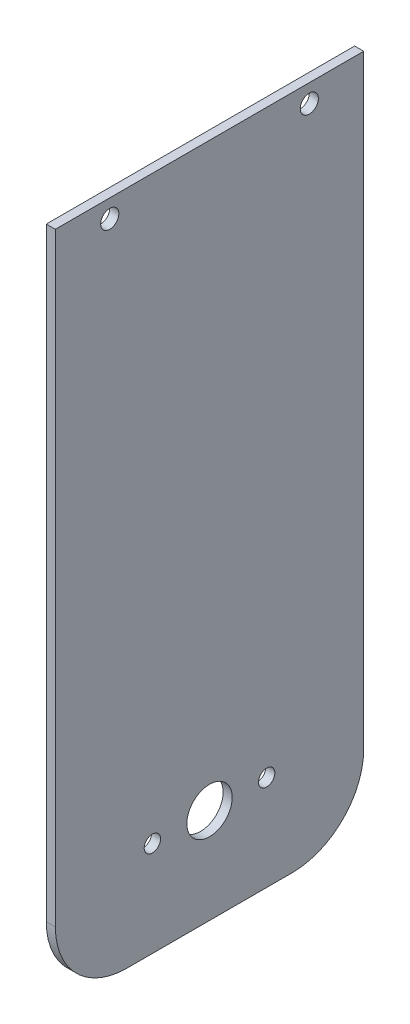
ISO-10303-21;
HEADER;
FILE_DESCRIPTION(('STEP AP214'),'2;1');
FILE_NAME('part.step','',(''),(''),'','','');
FILE_SCHEMA(('AUTOMOTIVE_DESIGN { 1 0 10303 214 1 1 1 1 }'));
ENDSEC;
DATA;
#1=APPLICATION_CONTEXT('core data for automotive mechanical design processes');
#2=APPLICATION_PROTOCOL_DEFINITION('international standard','automotive_design',2000,#1);
#3=PRODUCT_CONTEXT('',#1,'mechanical');
#4=PRODUCT('Part','Part','',(#3));
#5=PRODUCT_RELATED_PRODUCT_CATEGORY('part','',(#4));
#6=PRODUCT_DEFINITION_FORMATION('','',#4);
#7=PRODUCT_DEFINITION_CONTEXT('part definition',#1,'design');
#8=PRODUCT_DEFINITION('design','',#6,#7);
#9=PRODUCT_DEFINITION_SHAPE('','',#8);
#10=(LENGTH_UNIT() NAMED_UNIT(*) SI_UNIT(.MILLI.,.METRE.));
#11=(NAMED_UNIT(*) PLANE_ANGLE_UNIT() SI_UNIT($,.RADIAN.));
#12=(NAMED_UNIT(*) SI_UNIT($,.STERADIAN.) SOLID_ANGLE_UNIT());
#13=UNCERTAINTY_MEASURE_WITH_UNIT(LENGTH_MEASURE(1.E-05),#10,'distance_accuracy_value','');
#14=(GEOMETRIC_REPRESENTATION_CONTEXT(3) GLOBAL_UNCERTAINTY_ASSIGNED_CONTEXT((#13)) GLOBAL_UNIT_ASSIGNED_CONTEXT((#10,
#11,#12)) REPRESENTATION_CONTEXT('',''));
#15=CARTESIAN_POINT('',(0.,0.,0.));
#16=DIRECTION('',(0.,0.,1.));
#17=DIRECTION('',(1.,0.,0.));
#18=AXIS2_PLACEMENT_3D('',#15,#16,#17);
#19=CARTESIAN_POINT('',(3.175,0.,0.));
#20=DIRECTION('',(1.,0.,0.));
#21=DIRECTION('',(0.,0.,-1.));
#22=AXIS2_PLACEMENT_3D('',#19,#20,#21);
#23=PLANE('',#22);
#24=CARTESIAN_POINT('',(3.175,111.9175,34.925));
#25=DIRECTION('',(1.,0.,0.));
#26=DIRECTION('',(0.,0.,-1.));
#27=AXIS2_PLACEMENT_3D('',#24,#25,#26);
#28=CIRCLE('',#27,3.175);
#29=CARTESIAN_POINT('',(3.175,111.9175,31.75));
#30=VERTEX_POINT('',#29);
#31=EDGE_CURVE('E218',#30,#30,#28,.T.);
#32=ORIENTED_EDGE('',*,*,#31,.F.);
#33=EDGE_LOOP('',(#32));
#34=FACE_BOUND('',#33,.T.);
#35=CARTESIAN_POINT('',(3.175,-84.9275,-20.));
#36=DIRECTION('',(1.,0.,0.));
#37=DIRECTION('',(0.,0.,-1.));
#38=AXIS2_PLACEMENT_3D('',#35,#36,#37);
#39=CIRCLE('',#38,2.86);
#40=CARTESIAN_POINT('',(3.175,-84.9275,-22.86));
#41=VERTEX_POINT('',#40);
#42=EDGE_CURVE('E197',#41,#41,#39,.T.);
#43=ORIENTED_EDGE('',*,*,#42,.F.);
#44=EDGE_LOOP('',(#43));
#45=FACE_BOUND('',#44,.T.);
#46=DIRECTION('',(0.,-1.,0.));
#47=VECTOR('',#46,1.);
#48=CARTESIAN_POINT('',(3.175,118.2675,53.975));
#49=LINE('',#48,#47);
#50=CARTESIAN_POINT('',(3.175,118.2675,53.975));
#51=VERTEX_POINT('',#50);
#52=CARTESIAN_POINT('',(3.175,-93.2675,53.975));
#53=VERTEX_POINT('',#52);
#54=EDGE_CURVE('E124',#51,#53,#49,.T.);
#55=ORIENTED_EDGE('',*,*,#54,.T.);
#56=CARTESIAN_POINT('',(3.175,-93.2675,28.975));
#57=DIRECTION('',(1.,0.,0.));
#58=DIRECTION('',(0.,0.,-1.));
#59=AXIS2_PLACEMENT_3D('',#56,#57,#58);
#60=CIRCLE('',#59,25.);
#61=CARTESIAN_POINT('',(3.175,-118.2675,28.975));
#62=VERTEX_POINT('',#61);
#63=EDGE_CURVE('E61',#53,#62,#60,.T.);
#64=ORIENTED_EDGE('',*,*,#63,.T.);
#65=DIRECTION('',(0.,0.,-1.));
#66=VECTOR('',#65,1.);
#67=CARTESIAN_POINT('',(3.175,-118.2675,53.975));
#68=LINE('',#67,#66);
#69=CARTESIAN_POINT('',(3.175,-118.2675,-28.975));
#70=VERTEX_POINT('',#69);
#71=EDGE_CURVE('E137',#62,#70,#68,.T.);
#72=ORIENTED_EDGE('',*,*,#71,.T.);
#73=CARTESIAN_POINT('',(3.175,-93.2675,-28.975));
#74=DIRECTION('',(1.,0.,0.));
#75=DIRECTION('',(0.,0.,-1.));
#76=AXIS2_PLACEMENT_3D('',#73,#74,#75);
#77=CIRCLE('',#76,25.);
#78=CARTESIAN_POINT('',(3.175,-93.2675,-53.975));
#79=VERTEX_POINT('',#78);
#80=EDGE_CURVE('E68',#70,#79,#77,.T.);
#81=ORIENTED_EDGE('',*,*,#80,.T.);
#82=DIRECTION('',(0.,1.,0.));
#83=VECTOR('',#82,1.);
#84=CARTESIAN_POINT('',(3.175,118.2675,-53.975));
#85=LINE('',#84,#83);
#86=CARTESIAN_POINT('',(3.175,118.2675,-53.975));
#87=VERTEX_POINT('',#86);
#88=EDGE_CURVE('E106',#79,#87,#85,.T.);
#89=ORIENTED_EDGE('',*,*,#88,.T.);
#90=DIRECTION('',(0.,0.,1.));
#91=VECTOR('',#90,1.);
#92=CARTESIAN_POINT('',(3.175,118.2675,53.975));
#93=LINE('',#92,#91);
#94=EDGE_CURVE('E109',#87,#51,#93,.T.);
#95=ORIENTED_EDGE('',*,*,#94,.T.);
#96=EDGE_LOOP('',(#55,#64,#72,#81,#89,#95));
#97=FACE_BOUND('',#96,.T.);
#98=CARTESIAN_POINT('',(3.175,-84.9275,0.));
#99=DIRECTION('',(1.,0.,0.));
#100=DIRECTION('',(0.,0.,-1.));
#101=AXIS2_PLACEMENT_3D('',#98,#99,#100);
#102=CIRCLE('',#101,7.94);
#103=CARTESIAN_POINT('',(3.175,-84.9275,-7.94000000000003));
#104=VERTEX_POINT('',#103);
#105=EDGE_CURVE('E181',#104,#104,#102,.T.);
#106=ORIENTED_EDGE('',*,*,#105,.F.);
#107=EDGE_LOOP('',(#106));
#108=FACE_BOUND('',#107,.T.);
#109=CARTESIAN_POINT('',(3.175,-84.9275,20.));
#110=DIRECTION('',(1.,0.,0.));
#111=DIRECTION('',(0.,0.,-1.));
#112=AXIS2_PLACEMENT_3D('',#109,#110,#111);
#113=CIRCLE('',#112,2.86);
#114=CARTESIAN_POINT('',(3.175,-84.9275,17.14));
#115=VERTEX_POINT('',#114);
#116=EDGE_CURVE('E205',#115,#115,#113,.T.);
#117=ORIENTED_EDGE('',*,*,#116,.F.);
#118=EDGE_LOOP('',(#117));
#119=FACE_BOUND('',#118,.T.);
#120=CARTESIAN_POINT('',(3.175,111.9175,-34.925));
#121=DIRECTION('',(1.,0.,0.));
#122=DIRECTION('',(0.,0.,-1.));
#123=AXIS2_PLACEMENT_3D('',#120,#121,#122);
#124=CIRCLE('',#123,3.175);
#125=CARTESIAN_POINT('',(3.175,111.9175,-38.1));
#126=VERTEX_POINT('',#125);
#127=EDGE_CURVE('E232',#126,#126,#124,.T.);
#128=ORIENTED_EDGE('',*,*,#127,.F.);
#129=EDGE_LOOP('',(#128));
#130=FACE_BOUND('',#129,.T.);
#131=ADVANCED_FACE('F52',(#34,#45,#97,#108,#119,#130),#23,.T.);
#132=CARTESIAN_POINT('',(0.,0.,0.));
#133=DIRECTION('',(1.,0.,0.));
#134=DIRECTION('',(0.,0.,-1.));
#135=AXIS2_PLACEMENT_3D('',#132,#133,#134);
#136=PLANE('',#135);
#137=DIRECTION('',(0.,0.,-1.));
#138=VECTOR('',#137,1.);
#139=CARTESIAN_POINT('',(0.,-118.2675,53.975));
#140=LINE('',#139,#138);
#141=CARTESIAN_POINT('',(0.,-118.2675,28.975));
#142=VERTEX_POINT('',#141);
#143=CARTESIAN_POINT('',(0.,-118.2675,-28.975));
#144=VERTEX_POINT('',#143);
#145=EDGE_CURVE('E115',#142,#144,#140,.T.);
#146=ORIENTED_EDGE('',*,*,#145,.F.);
#147=CARTESIAN_POINT('',(0.,-93.2675,28.975));
#148=DIRECTION('',(1.,0.,0.));
#149=DIRECTION('',(0.,0.,-1.));
#150=AXIS2_PLACEMENT_3D('',#147,#148,#149);
#151=CIRCLE('',#150,25.);
#152=CARTESIAN_POINT('',(0.,-93.2675,53.975));
#153=VERTEX_POINT('',#152);
#154=EDGE_CURVE('E147',#142,#153,#151,.F.);
#155=ORIENTED_EDGE('',*,*,#154,.T.);
#156=DIRECTION('',(0.,-1.,0.));
#157=VECTOR('',#156,1.);
#158=CARTESIAN_POINT('',(0.,118.2675,53.975));
#159=LINE('',#158,#157);
#160=CARTESIAN_POINT('',(0.,118.2675,53.975));
#161=VERTEX_POINT('',#160);
#162=EDGE_CURVE('E170',#161,#153,#159,.T.);
#163=ORIENTED_EDGE('',*,*,#162,.F.);
#164=DIRECTION('',(0.,0.,1.));
#165=VECTOR('',#164,1.);
#166=CARTESIAN_POINT('',(0.,118.2675,53.975));
#167=LINE('',#166,#165);
#168=CARTESIAN_POINT('',(0.,118.2675,-53.975));
#169=VERTEX_POINT('',#168);
#170=EDGE_CURVE('E173',#169,#161,#167,.T.);
#171=ORIENTED_EDGE('',*,*,#170,.F.);
#172=DIRECTION('',(0.,1.,0.));
#173=VECTOR('',#172,1.);
#174=CARTESIAN_POINT('',(0.,118.2675,-53.975));
#175=LINE('',#174,#173);
#176=CARTESIAN_POINT('',(0.,-93.2675,-53.975));
#177=VERTEX_POINT('',#176);
#178=EDGE_CURVE('E128',#177,#169,#175,.T.);
#179=ORIENTED_EDGE('',*,*,#178,.F.);
#180=CARTESIAN_POINT('',(0.,-93.2675,-28.975));
#181=DIRECTION('',(1.,0.,0.));
#182=DIRECTION('',(0.,0.,-1.));
#183=AXIS2_PLACEMENT_3D('',#180,#181,#182);
#184=CIRCLE('',#183,25.);
#185=EDGE_CURVE('E144',#177,#144,#184,.F.);
#186=ORIENTED_EDGE('',*,*,#185,.T.);
#187=EDGE_LOOP('',(#146,#155,#163,#171,#179,#186));
#188=FACE_BOUND('',#187,.T.);
#189=CARTESIAN_POINT('',(0.,-84.9275,0.));
#190=DIRECTION('',(1.,0.,0.));
#191=DIRECTION('',(0.,0.,-1.));
#192=AXIS2_PLACEMENT_3D('',#189,#190,#191);
#193=CIRCLE('',#192,7.94);
#194=CARTESIAN_POINT('',(0.,-84.9275,-7.94000000000003));
#195=VERTEX_POINT('',#194);
#196=EDGE_CURVE('E193',#195,#195,#193,.T.);
#197=ORIENTED_EDGE('',*,*,#196,.T.);
#198=EDGE_LOOP('',(#197));
#199=FACE_BOUND('',#198,.T.);
#200=CARTESIAN_POINT('',(0.,-84.9275,-20.));
#201=DIRECTION('',(1.,0.,0.));
#202=DIRECTION('',(0.,0.,-1.));
#203=AXIS2_PLACEMENT_3D('',#200,#201,#202);
#204=CIRCLE('',#203,2.86);
#205=CARTESIAN_POINT('',(0.,-84.9275,-22.86));
#206=VERTEX_POINT('',#205);
#207=EDGE_CURVE('E200',#206,#206,#204,.T.);
#208=ORIENTED_EDGE('',*,*,#207,.T.);
#209=EDGE_LOOP('',(#208));
#210=FACE_BOUND('',#209,.T.);
#211=CARTESIAN_POINT('',(0.,-84.9275,20.));
#212=DIRECTION('',(1.,0.,0.));
#213=DIRECTION('',(0.,0.,-1.));
#214=AXIS2_PLACEMENT_3D('',#211,#212,#213);
#215=CIRCLE('',#214,2.86);
#216=CARTESIAN_POINT('',(0.,-84.9275,17.14));
#217=VERTEX_POINT('',#216);
#218=EDGE_CURVE('E214',#217,#217,#215,.T.);
#219=ORIENTED_EDGE('',*,*,#218,.T.);
#220=EDGE_LOOP('',(#219));
#221=FACE_BOUND('',#220,.T.);
#222=CARTESIAN_POINT('',(0.,111.9175,34.925));
#223=DIRECTION('',(1.,0.,0.));
#224=DIRECTION('',(0.,0.,-1.));
#225=AXIS2_PLACEMENT_3D('',#222,#223,#224);
#226=CIRCLE('',#225,3.175);
#227=CARTESIAN_POINT('',(0.,111.9175,31.75));
#228=VERTEX_POINT('',#227);
#229=EDGE_CURVE('E227',#228,#228,#226,.T.);
#230=ORIENTED_EDGE('',*,*,#229,.T.);
#231=EDGE_LOOP('',(#230));
#232=FACE_BOUND('',#231,.T.);
#233=CARTESIAN_POINT('',(0.,111.9175,-34.925));
#234=DIRECTION('',(1.,0.,0.));
#235=DIRECTION('',(0.,0.,-1.));
#236=AXIS2_PLACEMENT_3D('',#233,#234,#235);
#237=CIRCLE('',#236,3.175);
#238=CARTESIAN_POINT('',(0.,111.9175,-38.1));
#239=VERTEX_POINT('',#238);
#240=EDGE_CURVE('E237',#239,#239,#237,.T.);
#241=ORIENTED_EDGE('',*,*,#240,.T.);
#242=EDGE_LOOP('',(#241));
#243=FACE_BOUND('',#242,.T.);
#244=ADVANCED_FACE('F168',(#188,#199,#210,#221,#232,#243),#136,.F.);
#245=CARTESIAN_POINT('',(3.175,118.2675,-53.975));
#246=DIRECTION('',(0.,0.,1.));
#247=DIRECTION('',(0.,-1.,0.));
#248=AXIS2_PLACEMENT_3D('',#245,#246,#247);
#249=PLANE('',#248);
#250=ORIENTED_EDGE('',*,*,#88,.F.);
#251=DIRECTION('',(-1.,0.,0.));
#252=VECTOR('',#251,1.);
#253=CARTESIAN_POINT('',(3.175,-93.2675,-53.975));
#254=LINE('',#253,#252);
#255=EDGE_CURVE('E12',#79,#177,#254,.T.);
#256=ORIENTED_EDGE('',*,*,#255,.T.);
#257=ORIENTED_EDGE('',*,*,#178,.T.);
#258=DIRECTION('',(-1.,0.,0.));
#259=VECTOR('',#258,1.);
#260=CARTESIAN_POINT('',(3.175,118.2675,-53.975));
#261=LINE('',#260,#259);
#262=EDGE_CURVE('E120',#87,#169,#261,.T.);
#263=ORIENTED_EDGE('',*,*,#262,.F.);
#264=EDGE_LOOP('',(#250,#256,#257,#263));
#265=FACE_BOUND('',#264,.T.);
#266=ADVANCED_FACE('F126',(#265),#249,.F.);
#267=CARTESIAN_POINT('',(3.175,118.2675,53.975));
#268=DIRECTION('',(0.,-1.,0.));
#269=DIRECTION('',(0.,0.,-1.));
#270=AXIS2_PLACEMENT_3D('',#267,#268,#269);
#271=PLANE('',#270);
#272=ORIENTED_EDGE('',*,*,#170,.T.);
#273=DIRECTION('',(-1.,0.,0.));
#274=VECTOR('',#273,1.);
#275=CARTESIAN_POINT('',(3.175,118.2675,53.975));
#276=LINE('',#275,#274);
#277=EDGE_CURVE('E122',#51,#161,#276,.T.);
#278=ORIENTED_EDGE('',*,*,#277,.F.);
#279=ORIENTED_EDGE('',*,*,#94,.F.);
#280=ORIENTED_EDGE('',*,*,#262,.T.);
#281=EDGE_LOOP('',(#272,#278,#279,#280));
#282=FACE_BOUND('',#281,.T.);
#283=ADVANCED_FACE('F119',(#282),#271,.F.);
#284=CARTESIAN_POINT('',(3.175,118.2675,53.975));
#285=DIRECTION('',(0.,0.,-1.));
#286=DIRECTION('',(0.,1.,0.));
#287=AXIS2_PLACEMENT_3D('',#284,#285,#286);
#288=PLANE('',#287);
#289=ORIENTED_EDGE('',*,*,#162,.T.);
#290=DIRECTION('',(-1.,0.,0.));
#291=VECTOR('',#290,1.);
#292=CARTESIAN_POINT('',(3.175,-93.2675,53.975));
#293=LINE('',#292,#291);
#294=EDGE_CURVE('E76',#153,#53,#293,.F.);
#295=ORIENTED_EDGE('',*,*,#294,.T.);
#296=ORIENTED_EDGE('',*,*,#54,.F.);
#297=ORIENTED_EDGE('',*,*,#277,.T.);
#298=EDGE_LOOP('',(#289,#295,#296,#297));
#299=FACE_BOUND('',#298,.T.);
#300=ADVANCED_FACE('F171',(#299),#288,.F.);
#301=CARTESIAN_POINT('',(3.175,-118.2675,53.975));
#302=DIRECTION('',(0.,1.,0.));
#303=DIRECTION('',(0.,0.,1.));
#304=AXIS2_PLACEMENT_3D('',#301,#302,#303);
#305=PLANE('',#304);
#306=ORIENTED_EDGE('',*,*,#71,.F.);
#307=DIRECTION('',(-1.,0.,0.));
#308=VECTOR('',#307,1.);
#309=CARTESIAN_POINT('',(3.175,-118.2675,28.975));
#310=LINE('',#309,#308);
#311=EDGE_CURVE('E135',#62,#142,#310,.T.);
#312=ORIENTED_EDGE('',*,*,#311,.T.);
#313=ORIENTED_EDGE('',*,*,#145,.T.);
#314=DIRECTION('',(-1.,0.,0.));
#315=VECTOR('',#314,1.);
#316=CARTESIAN_POINT('',(3.175,-118.2675,-28.975));
#317=LINE('',#316,#315);
#318=EDGE_CURVE('E131',#144,#70,#317,.F.);
#319=ORIENTED_EDGE('',*,*,#318,.T.);
#320=EDGE_LOOP('',(#306,#312,#313,#319));
#321=FACE_BOUND('',#320,.T.);
#322=ADVANCED_FACE('F159',(#321),#305,.F.);
#323=CARTESIAN_POINT('',(3.175,-84.9275,0.));
#324=DIRECTION('',(-1.,0.,0.));
#325=DIRECTION('',(0.,0.,1.));
#326=AXIS2_PLACEMENT_3D('',#323,#324,#325);
#327=CYLINDRICAL_SURFACE('',#326,7.94);
#328=ORIENTED_EDGE('',*,*,#105,.T.);
#329=EDGE_LOOP('',(#328));
#330=FACE_BOUND('',#329,.T.);
#331=ORIENTED_EDGE('',*,*,#196,.F.);
#332=EDGE_LOOP('',(#331));
#333=FACE_BOUND('',#332,.T.);
#334=ADVANCED_FACE('F260',(#330,#333),#327,.F.);
#335=CARTESIAN_POINT('',(3.175,-84.9275,-20.));
#336=DIRECTION('',(-1.,0.,0.));
#337=DIRECTION('',(0.,0.,1.));
#338=AXIS2_PLACEMENT_3D('',#335,#336,#337);
#339=CYLINDRICAL_SURFACE('',#338,2.86);
#340=ORIENTED_EDGE('',*,*,#42,.T.);
#341=EDGE_LOOP('',(#340));
#342=FACE_BOUND('',#341,.T.);
#343=ORIENTED_EDGE('',*,*,#207,.F.);
#344=EDGE_LOOP('',(#343));
#345=FACE_BOUND('',#344,.T.);
#346=ADVANCED_FACE('F286',(#342,#345),#339,.F.);
#347=CARTESIAN_POINT('',(3.175,-84.9275,20.));
#348=DIRECTION('',(-1.,0.,0.));
#349=DIRECTION('',(0.,0.,1.));
#350=AXIS2_PLACEMENT_3D('',#347,#348,#349);
#351=CYLINDRICAL_SURFACE('',#350,2.86);
#352=ORIENTED_EDGE('',*,*,#116,.T.);
#353=EDGE_LOOP('',(#352));
#354=FACE_BOUND('',#353,.T.);
#355=ORIENTED_EDGE('',*,*,#218,.F.);
#356=EDGE_LOOP('',(#355));
#357=FACE_BOUND('',#356,.T.);
#358=ADVANCED_FACE('F281',(#354,#357),#351,.F.);
#359=CARTESIAN_POINT('',(3.175,111.9175,34.925));
#360=DIRECTION('',(-1.,0.,0.));
#361=DIRECTION('',(0.,0.,1.));
#362=AXIS2_PLACEMENT_3D('',#359,#360,#361);
#363=CYLINDRICAL_SURFACE('',#362,3.175);
#364=ORIENTED_EDGE('',*,*,#31,.T.);
#365=EDGE_LOOP('',(#364));
#366=FACE_BOUND('',#365,.T.);
#367=ORIENTED_EDGE('',*,*,#229,.F.);
#368=EDGE_LOOP('',(#367));
#369=FACE_BOUND('',#368,.T.);
#370=ADVANCED_FACE('F277',(#366,#369),#363,.F.);
#371=CARTESIAN_POINT('',(3.175,111.9175,-34.925));
#372=DIRECTION('',(-1.,0.,0.));
#373=DIRECTION('',(0.,0.,1.));
#374=AXIS2_PLACEMENT_3D('',#371,#372,#373);
#375=CYLINDRICAL_SURFACE('',#374,3.175);
#376=ORIENTED_EDGE('',*,*,#127,.T.);
#377=EDGE_LOOP('',(#376));
#378=FACE_BOUND('',#377,.T.);
#379=ORIENTED_EDGE('',*,*,#240,.F.);
#380=EDGE_LOOP('',(#379));
#381=FACE_BOUND('',#380,.T.);
#382=ADVANCED_FACE('F248',(#378,#381),#375,.F.);
#383=CARTESIAN_POINT('',(3.175,-93.2675,28.975));
#384=DIRECTION('',(-1.,0.,0.));
#385=DIRECTION('',(0.,0.,1.));
#386=AXIS2_PLACEMENT_3D('',#383,#384,#385);
#387=CYLINDRICAL_SURFACE('',#386,25.);
#388=ORIENTED_EDGE('',*,*,#63,.F.);
#389=ORIENTED_EDGE('',*,*,#294,.F.);
#390=ORIENTED_EDGE('',*,*,#154,.F.);
#391=ORIENTED_EDGE('',*,*,#311,.F.);
#392=EDGE_LOOP('',(#388,#389,#390,#391));
#393=FACE_BOUND('',#392,.T.);
#394=ADVANCED_FACE('F165',(#393),#387,.T.);
#395=CARTESIAN_POINT('',(3.175,-93.2675,-28.975));
#396=DIRECTION('',(-1.,0.,0.));
#397=DIRECTION('',(0.,0.,1.));
#398=AXIS2_PLACEMENT_3D('',#395,#396,#397);
#399=CYLINDRICAL_SURFACE('',#398,25.);
#400=ORIENTED_EDGE('',*,*,#80,.F.);
#401=ORIENTED_EDGE('',*,*,#318,.F.);
#402=ORIENTED_EDGE('',*,*,#185,.F.);
#403=ORIENTED_EDGE('',*,*,#255,.F.);
#404=EDGE_LOOP('',(#400,#401,#402,#403));
#405=FACE_BOUND('',#404,.T.);
#406=ADVANCED_FACE('F54',(#405),#399,.T.);
#407=CLOSED_SHELL('',(#131,#244,#266,#283,#300,#322,#334,#346,#358,#370,#382,#394,#406));
#408=MANIFOLD_SOLID_BREP('B2',#407);
#409=ADVANCED_BREP_SHAPE_REPRESENTATION('',(#18,#408),#14);
#410=SHAPE_DEFINITION_REPRESENTATION(#9,#409);
ENDSEC;
END-ISO-10303-21;
